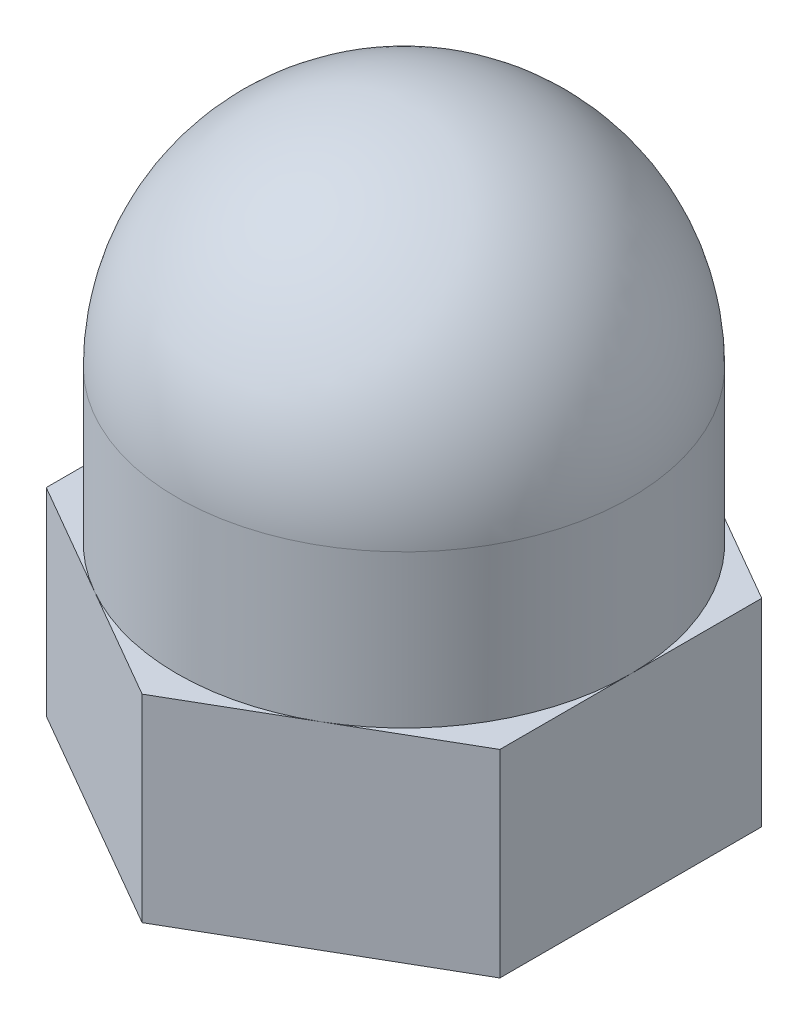
ISO-10303-21;
HEADER;
FILE_DESCRIPTION(('STEP AP214'),'2;1');
FILE_NAME('part.step','',(''),(''),'','','');
FILE_SCHEMA(('AUTOMOTIVE_DESIGN { 1 0 10303 214 1 1 1 1 }'));
ENDSEC;
DATA;
#1=APPLICATION_CONTEXT('core data for automotive mechanical design processes');
#2=APPLICATION_PROTOCOL_DEFINITION('international standard','automotive_design',2000,#1);
#3=PRODUCT_CONTEXT('',#1,'mechanical');
#4=PRODUCT('Part','Part','',(#3));
#5=PRODUCT_RELATED_PRODUCT_CATEGORY('part','',(#4));
#6=PRODUCT_DEFINITION_FORMATION('','',#4);
#7=PRODUCT_DEFINITION_CONTEXT('part definition',#1,'design');
#8=PRODUCT_DEFINITION('design','',#6,#7);
#9=PRODUCT_DEFINITION_SHAPE('','',#8);
#10=(LENGTH_UNIT() NAMED_UNIT(*) SI_UNIT(.MILLI.,.METRE.));
#11=(NAMED_UNIT(*) PLANE_ANGLE_UNIT() SI_UNIT($,.RADIAN.));
#12=(NAMED_UNIT(*) SI_UNIT($,.STERADIAN.) SOLID_ANGLE_UNIT());
#13=UNCERTAINTY_MEASURE_WITH_UNIT(LENGTH_MEASURE(1.E-05),#10,'distance_accuracy_value','');
#14=(GEOMETRIC_REPRESENTATION_CONTEXT(3) GLOBAL_UNCERTAINTY_ASSIGNED_CONTEXT((#13)) GLOBAL_UNIT_ASSIGNED_CONTEXT((#10,
#11,#12)) REPRESENTATION_CONTEXT('',''));
#15=CARTESIAN_POINT('',(0.,0.,0.));
#16=DIRECTION('',(0.,0.,1.));
#17=DIRECTION('',(1.,0.,0.));
#18=AXIS2_PLACEMENT_3D('',#15,#16,#17);
#19=CARTESIAN_POINT('',(0.,2.4,0.));
#20=DIRECTION('',(0.,1.,0.));
#21=DIRECTION('',(0.,0.,1.));
#22=AXIS2_PLACEMENT_3D('',#19,#20,#21);
#23=PLANE('',#22);
#24=CARTESIAN_POINT('',(0.,2.4,0.));
#25=DIRECTION('',(0.,1.,0.));
#26=DIRECTION('',(-1.,0.,0.));
#27=AXIS2_PLACEMENT_3D('',#24,#25,#26);
#28=CIRCLE('',#27,2.75);
#29=CARTESIAN_POINT('',(-2.75,2.4,0.));
#30=VERTEX_POINT('',#29);
#31=CARTESIAN_POINT('',(-1.375,2.4,2.38156986040721));
#32=VERTEX_POINT('',#31);
#33=EDGE_CURVE('E49',#30,#32,#28,.T.);
#34=ORIENTED_EDGE('',*,*,#33,.F.);
#35=DIRECTION('',(0.,0.,1.));
#36=VECTOR('',#35,1.);
#37=CARTESIAN_POINT('',(-2.75,2.4,-1.58771324027147));
#38=LINE('',#37,#36);
#39=CARTESIAN_POINT('',(-2.75,2.4,1.58771324027147));
#40=VERTEX_POINT('',#39);
#41=EDGE_CURVE('E123',#30,#40,#38,.T.);
#42=ORIENTED_EDGE('',*,*,#41,.T.);
#43=DIRECTION('',(0.866025403784439,0.,0.5));
#44=VECTOR('',#43,1.);
#45=CARTESIAN_POINT('',(-2.75,2.4,1.58771324027147));
#46=LINE('',#45,#44);
#47=EDGE_CURVE('E135',#40,#32,#46,.T.);
#48=ORIENTED_EDGE('',*,*,#47,.T.);
#49=EDGE_LOOP('',(#34,#42,#48));
#50=FACE_BOUND('',#49,.T.);
#51=ADVANCED_FACE('F38',(#50),#23,.T.);
#52=CARTESIAN_POINT('',(1.375,2.4,2.38156986040721));
#53=VERTEX_POINT('',#52);
#54=EDGE_CURVE('E11',#32,#53,#28,.T.);
#55=ORIENTED_EDGE('',*,*,#54,.F.);
#56=CARTESIAN_POINT('',(0.,2.4,3.17542648054294));
#57=VERTEX_POINT('',#56);
#58=EDGE_CURVE('E122',#32,#57,#46,.T.);
#59=ORIENTED_EDGE('',*,*,#58,.T.);
#60=DIRECTION('',(0.866025403784439,0.,-0.5));
#61=VECTOR('',#60,1.);
#62=CARTESIAN_POINT('',(0.,2.4,3.17542648054294));
#63=LINE('',#62,#61);
#64=EDGE_CURVE('E159',#57,#53,#63,.T.);
#65=ORIENTED_EDGE('',*,*,#64,.T.);
#66=EDGE_LOOP('',(#55,#59,#65));
#67=FACE_BOUND('',#66,.T.);
#68=ADVANCED_FACE('F204',(#67),#23,.T.);
#69=CARTESIAN_POINT('',(2.75,2.4,0.));
#70=VERTEX_POINT('',#69);
#71=EDGE_CURVE('E47',#53,#70,#28,.T.);
#72=ORIENTED_EDGE('',*,*,#71,.F.);
#73=CARTESIAN_POINT('',(2.75,2.4,1.58771324027147));
#74=VERTEX_POINT('',#73);
#75=EDGE_CURVE('E158',#53,#74,#63,.T.);
#76=ORIENTED_EDGE('',*,*,#75,.T.);
#77=DIRECTION('',(0.,0.,-1.));
#78=VECTOR('',#77,1.);
#79=CARTESIAN_POINT('',(2.75,2.4,1.58771324027147));
#80=LINE('',#79,#78);
#81=EDGE_CURVE('E163',#74,#70,#80,.T.);
#82=ORIENTED_EDGE('',*,*,#81,.T.);
#83=EDGE_LOOP('',(#72,#76,#82));
#84=FACE_BOUND('',#83,.T.);
#85=ADVANCED_FACE('F206',(#84),#23,.T.);
#86=CARTESIAN_POINT('',(1.375,2.4,-2.38156986040721));
#87=VERTEX_POINT('',#86);
#88=EDGE_CURVE('E56',#70,#87,#28,.T.);
#89=ORIENTED_EDGE('',*,*,#88,.F.);
#90=CARTESIAN_POINT('',(2.75,2.4,-1.58771324027147));
#91=VERTEX_POINT('',#90);
#92=EDGE_CURVE('E162',#70,#91,#80,.T.);
#93=ORIENTED_EDGE('',*,*,#92,.T.);
#94=DIRECTION('',(-0.866025403784439,0.,-0.5));
#95=VECTOR('',#94,1.);
#96=CARTESIAN_POINT('',(2.75,2.4,-1.58771324027147));
#97=LINE('',#96,#95);
#98=EDGE_CURVE('E152',#91,#87,#97,.T.);
#99=ORIENTED_EDGE('',*,*,#98,.T.);
#100=EDGE_LOOP('',(#89,#93,#99));
#101=FACE_BOUND('',#100,.T.);
#102=ADVANCED_FACE('F212',(#101),#23,.T.);
#103=CARTESIAN_POINT('',(-1.375,2.4,-2.38156986040721));
#104=VERTEX_POINT('',#103);
#105=EDGE_CURVE('E141',#87,#104,#28,.T.);
#106=ORIENTED_EDGE('',*,*,#105,.F.);
#107=CARTESIAN_POINT('',(0.,2.4,-3.17542648054294));
#108=VERTEX_POINT('',#107);
#109=EDGE_CURVE('E154',#87,#108,#97,.T.);
#110=ORIENTED_EDGE('',*,*,#109,.T.);
#111=DIRECTION('',(-0.866025403784439,0.,0.5));
#112=VECTOR('',#111,1.);
#113=CARTESIAN_POINT('',(0.,2.4,-3.17542648054294));
#114=LINE('',#113,#112);
#115=EDGE_CURVE('E133',#108,#104,#114,.T.);
#116=ORIENTED_EDGE('',*,*,#115,.T.);
#117=EDGE_LOOP('',(#106,#110,#116));
#118=FACE_BOUND('',#117,.T.);
#119=ADVANCED_FACE('F216',(#118),#23,.T.);
#120=EDGE_CURVE('E116',#104,#30,#28,.T.);
#121=ORIENTED_EDGE('',*,*,#120,.F.);
#122=CARTESIAN_POINT('',(-2.75,2.4,-1.58771324027147));
#123=VERTEX_POINT('',#122);
#124=EDGE_CURVE('E118',#104,#123,#114,.T.);
#125=ORIENTED_EDGE('',*,*,#124,.T.);
#126=EDGE_CURVE('E112',#123,#30,#38,.T.);
#127=ORIENTED_EDGE('',*,*,#126,.T.);
#128=EDGE_LOOP('',(#121,#125,#127));
#129=FACE_BOUND('',#128,.T.);
#130=ADVANCED_FACE('F114',(#129),#23,.T.);
#131=CARTESIAN_POINT('',(0.,0.,0.));
#132=DIRECTION('',(0.,1.,0.));
#133=DIRECTION('',(0.,0.,1.));
#134=AXIS2_PLACEMENT_3D('',#131,#132,#133);
#135=PLANE('',#134);
#136=DIRECTION('',(-0.866025403784439,0.,-0.5));
#137=VECTOR('',#136,1.);
#138=CARTESIAN_POINT('',(2.75,0.,-1.58771324027147));
#139=LINE('',#138,#137);
#140=CARTESIAN_POINT('',(2.75,0.,-1.58771324027147));
#141=VERTEX_POINT('',#140);
#142=CARTESIAN_POINT('',(0.,0.,-3.17542648054294));
#143=VERTEX_POINT('',#142);
#144=EDGE_CURVE('E151',#141,#143,#139,.T.);
#145=ORIENTED_EDGE('',*,*,#144,.F.);
#146=DIRECTION('',(0.,0.,-1.));
#147=VECTOR('',#146,1.);
#148=CARTESIAN_POINT('',(2.75,0.,1.58771324027147));
#149=LINE('',#148,#147);
#150=CARTESIAN_POINT('',(2.75,0.,1.58771324027147));
#151=VERTEX_POINT('',#150);
#152=EDGE_CURVE('E176',#151,#141,#149,.T.);
#153=ORIENTED_EDGE('',*,*,#152,.F.);
#154=DIRECTION('',(0.866025403784439,0.,-0.5));
#155=VECTOR('',#154,1.);
#156=CARTESIAN_POINT('',(0.,0.,3.17542648054294));
#157=LINE('',#156,#155);
#158=CARTESIAN_POINT('',(0.,0.,3.17542648054294));
#159=VERTEX_POINT('',#158);
#160=EDGE_CURVE('E174',#159,#151,#157,.T.);
#161=ORIENTED_EDGE('',*,*,#160,.F.);
#162=DIRECTION('',(0.866025403784439,0.,0.5));
#163=VECTOR('',#162,1.);
#164=CARTESIAN_POINT('',(-2.75,0.,1.58771324027147));
#165=LINE('',#164,#163);
#166=CARTESIAN_POINT('',(-2.75,0.,1.58771324027147));
#167=VERTEX_POINT('',#166);
#168=EDGE_CURVE('E172',#167,#159,#165,.T.);
#169=ORIENTED_EDGE('',*,*,#168,.F.);
#170=DIRECTION('',(0.,0.,1.));
#171=VECTOR('',#170,1.);
#172=CARTESIAN_POINT('',(-2.75,0.,-1.58771324027147));
#173=LINE('',#172,#171);
#174=CARTESIAN_POINT('',(-2.75,0.,-1.58771324027147));
#175=VERTEX_POINT('',#174);
#176=EDGE_CURVE('E170',#175,#167,#173,.T.);
#177=ORIENTED_EDGE('',*,*,#176,.F.);
#178=DIRECTION('',(-0.866025403784439,0.,0.5));
#179=VECTOR('',#178,1.);
#180=CARTESIAN_POINT('',(0.,0.,-3.17542648054294));
#181=LINE('',#180,#179);
#182=EDGE_CURVE('E168',#143,#175,#181,.T.);
#183=ORIENTED_EDGE('',*,*,#182,.F.);
#184=EDGE_LOOP('',(#145,#153,#161,#169,#177,#183));
#185=FACE_BOUND('',#184,.T.);
#186=CARTESIAN_POINT('',(0.,0.,0.));
#187=DIRECTION('',(0.,1.,0.));
#188=DIRECTION('',(0.,0.,1.));
#189=AXIS2_PLACEMENT_3D('',#186,#187,#188);
#190=CIRCLE('',#189,1.5);
#191=CARTESIAN_POINT('',(0.,0.,1.5));
#192=VERTEX_POINT('',#191);
#193=EDGE_CURVE('E148',#192,#192,#190,.T.);
#194=ORIENTED_EDGE('',*,*,#193,.T.);
#195=EDGE_LOOP('',(#194));
#196=FACE_BOUND('',#195,.T.);
#197=ADVANCED_FACE('F191',(#185,#196),#135,.F.);
#198=CARTESIAN_POINT('',(2.75,2.4,-1.58771324027147));
#199=DIRECTION('',(-0.5,0.,0.866025403784439));
#200=DIRECTION('',(0.866025403784439,0.,0.5));
#201=AXIS2_PLACEMENT_3D('',#198,#199,#200);
#202=PLANE('',#201);
#203=ORIENTED_EDGE('',*,*,#144,.T.);
#204=DIRECTION('',(0.,-1.,0.));
#205=VECTOR('',#204,1.);
#206=CARTESIAN_POINT('',(0.,2.4,-3.17542648054294));
#207=LINE('',#206,#205);
#208=EDGE_CURVE('E42',#108,#143,#207,.T.);
#209=ORIENTED_EDGE('',*,*,#208,.F.);
#210=ORIENTED_EDGE('',*,*,#109,.F.);
#211=ORIENTED_EDGE('',*,*,#98,.F.);
#212=DIRECTION('',(0.,-1.,0.));
#213=VECTOR('',#212,1.);
#214=CARTESIAN_POINT('',(2.75,2.4,-1.58771324027147));
#215=LINE('',#214,#213);
#216=EDGE_CURVE('E165',#91,#141,#215,.T.);
#217=ORIENTED_EDGE('',*,*,#216,.T.);
#218=EDGE_LOOP('',(#203,#209,#210,#211,#217));
#219=FACE_BOUND('',#218,.T.);
#220=ADVANCED_FACE('F40',(#219),#202,.F.);
#221=CARTESIAN_POINT('',(0.,2.4,-3.17542648054294));
#222=DIRECTION('',(0.5,0.,0.866025403784439));
#223=DIRECTION('',(0.866025403784439,0.,-0.5));
#224=AXIS2_PLACEMENT_3D('',#221,#222,#223);
#225=PLANE('',#224);
#226=ORIENTED_EDGE('',*,*,#182,.T.);
#227=DIRECTION('',(0.,-1.,0.));
#228=VECTOR('',#227,1.);
#229=CARTESIAN_POINT('',(-2.75,2.4,-1.58771324027147));
#230=LINE('',#229,#228);
#231=EDGE_CURVE('E143',#123,#175,#230,.T.);
#232=ORIENTED_EDGE('',*,*,#231,.F.);
#233=ORIENTED_EDGE('',*,*,#124,.F.);
#234=ORIENTED_EDGE('',*,*,#115,.F.);
#235=ORIENTED_EDGE('',*,*,#208,.T.);
#236=EDGE_LOOP('',(#226,#232,#233,#234,#235));
#237=FACE_BOUND('',#236,.T.);
#238=ADVANCED_FACE('F230',(#237),#225,.F.);
#239=CARTESIAN_POINT('',(-2.75,2.4,-1.58771324027147));
#240=DIRECTION('',(1.,0.,0.));
#241=DIRECTION('',(0.,0.,-1.));
#242=AXIS2_PLACEMENT_3D('',#239,#240,#241);
#243=PLANE('',#242);
#244=ORIENTED_EDGE('',*,*,#176,.T.);
#245=DIRECTION('',(0.,-1.,0.));
#246=VECTOR('',#245,1.);
#247=CARTESIAN_POINT('',(-2.75,2.4,1.58771324027147));
#248=LINE('',#247,#246);
#249=EDGE_CURVE('E129',#40,#167,#248,.T.);
#250=ORIENTED_EDGE('',*,*,#249,.F.);
#251=ORIENTED_EDGE('',*,*,#41,.F.);
#252=ORIENTED_EDGE('',*,*,#126,.F.);
#253=ORIENTED_EDGE('',*,*,#231,.T.);
#254=EDGE_LOOP('',(#244,#250,#251,#252,#253));
#255=FACE_BOUND('',#254,.T.);
#256=ADVANCED_FACE('F127',(#255),#243,.F.);
#257=CARTESIAN_POINT('',(-2.75,2.4,1.58771324027147));
#258=DIRECTION('',(0.5,0.,-0.866025403784439));
#259=DIRECTION('',(-0.866025403784439,0.,-0.5));
#260=AXIS2_PLACEMENT_3D('',#257,#258,#259);
#261=PLANE('',#260);
#262=ORIENTED_EDGE('',*,*,#168,.T.);
#263=DIRECTION('',(0.,-1.,0.));
#264=VECTOR('',#263,1.);
#265=CARTESIAN_POINT('',(0.,2.4,3.17542648054294));
#266=LINE('',#265,#264);
#267=EDGE_CURVE('E183',#57,#159,#266,.T.);
#268=ORIENTED_EDGE('',*,*,#267,.F.);
#269=ORIENTED_EDGE('',*,*,#58,.F.);
#270=ORIENTED_EDGE('',*,*,#47,.F.);
#271=ORIENTED_EDGE('',*,*,#249,.T.);
#272=EDGE_LOOP('',(#262,#268,#269,#270,#271));
#273=FACE_BOUND('',#272,.T.);
#274=ADVANCED_FACE('F197',(#273),#261,.F.);
#275=CARTESIAN_POINT('',(0.,2.4,3.17542648054294));
#276=DIRECTION('',(-0.5,0.,-0.866025403784439));
#277=DIRECTION('',(-0.866025403784439,0.,0.5));
#278=AXIS2_PLACEMENT_3D('',#275,#276,#277);
#279=PLANE('',#278);
#280=ORIENTED_EDGE('',*,*,#160,.T.);
#281=DIRECTION('',(0.,-1.,0.));
#282=VECTOR('',#281,1.);
#283=CARTESIAN_POINT('',(2.75,2.4,1.58771324027147));
#284=LINE('',#283,#282);
#285=EDGE_CURVE('E180',#74,#151,#284,.T.);
#286=ORIENTED_EDGE('',*,*,#285,.F.);
#287=ORIENTED_EDGE('',*,*,#75,.F.);
#288=ORIENTED_EDGE('',*,*,#64,.F.);
#289=ORIENTED_EDGE('',*,*,#267,.T.);
#290=EDGE_LOOP('',(#280,#286,#287,#288,#289));
#291=FACE_BOUND('',#290,.T.);
#292=ADVANCED_FACE('F201',(#291),#279,.F.);
#293=CARTESIAN_POINT('',(2.75,2.4,1.58771324027147));
#294=DIRECTION('',(-1.,0.,0.));
#295=DIRECTION('',(0.,0.,1.));
#296=AXIS2_PLACEMENT_3D('',#293,#294,#295);
#297=PLANE('',#296);
#298=ORIENTED_EDGE('',*,*,#152,.T.);
#299=ORIENTED_EDGE('',*,*,#216,.F.);
#300=ORIENTED_EDGE('',*,*,#92,.F.);
#301=ORIENTED_EDGE('',*,*,#81,.F.);
#302=ORIENTED_EDGE('',*,*,#285,.T.);
#303=EDGE_LOOP('',(#298,#299,#300,#301,#302));
#304=FACE_BOUND('',#303,.T.);
#305=ADVANCED_FACE('F221',(#304),#297,.F.);
#306=CARTESIAN_POINT('',(0.,2.4,0.));
#307=DIRECTION('',(0.,-1.,0.));
#308=DIRECTION('',(0.,0.,-1.));
#309=AXIS2_PLACEMENT_3D('',#306,#307,#308);
#310=CYLINDRICAL_SURFACE('',#309,1.5);
#311=CARTESIAN_POINT('',(0.,2.4,0.));
#312=DIRECTION('',(0.,1.,0.));
#313=DIRECTION('',(0.,0.,1.));
#314=AXIS2_PLACEMENT_3D('',#311,#312,#313);
#315=CIRCLE('',#314,1.5);
#316=CARTESIAN_POINT('',(0.,2.4,1.5));
#317=VERTEX_POINT('',#316);
#318=EDGE_CURVE('E137',#317,#317,#315,.T.);
#319=ORIENTED_EDGE('',*,*,#318,.T.);
#320=EDGE_LOOP('',(#319));
#321=FACE_BOUND('',#320,.T.);
#322=ORIENTED_EDGE('',*,*,#193,.F.);
#323=EDGE_LOOP('',(#322));
#324=FACE_BOUND('',#323,.T.);
#325=ADVANCED_FACE('F217',(#321,#324),#310,.F.);
#326=CARTESIAN_POINT('',(0.,7.,0.));
#327=DIRECTION('',(0.,1.,0.));
#328=DIRECTION('',(-1.,0.,0.));
#329=AXIS2_PLACEMENT_3D('',#326,#327,#328);
#330=CYLINDRICAL_SURFACE('',#329,2.75);
#331=CARTESIAN_POINT('',(0.,4.25,0.));
#332=DIRECTION('',(0.,1.,0.));
#333=DIRECTION('',(-1.,0.,0.));
#334=AXIS2_PLACEMENT_3D('',#331,#332,#333);
#335=CIRCLE('',#334,2.75);
#336=CARTESIAN_POINT('',(-2.75,4.25,0.));
#337=VERTEX_POINT('',#336);
#338=EDGE_CURVE('E138',#337,#337,#335,.T.);
#339=ORIENTED_EDGE('',*,*,#338,.F.);
#340=EDGE_LOOP('',(#339));
#341=FACE_BOUND('',#340,.T.);
#342=ORIENTED_EDGE('',*,*,#33,.T.);
#343=ORIENTED_EDGE('',*,*,#54,.T.);
#344=ORIENTED_EDGE('',*,*,#71,.T.);
#345=ORIENTED_EDGE('',*,*,#88,.T.);
#346=ORIENTED_EDGE('',*,*,#105,.T.);
#347=ORIENTED_EDGE('',*,*,#120,.T.);
#348=EDGE_LOOP('',(#342,#343,#344,#345,#346,#347));
#349=FACE_BOUND('',#348,.T.);
#350=ADVANCED_FACE('F140',(#341,#349),#330,.T.);
#351=CARTESIAN_POINT('',(0.,4.25,0.));
#352=DIRECTION('',(0.,1.,0.));
#353=DIRECTION('',(-1.,0.,0.));
#354=AXIS2_PLACEMENT_3D('',#351,#352,#353);
#355=SPHERICAL_SURFACE('',#354,2.75);
#356=ORIENTED_EDGE('',*,*,#338,.T.);
#357=EDGE_LOOP('',(#356));
#358=FACE_BOUND('',#357,.T.);
#359=ADVANCED_FACE('F325',(#358),#355,.T.);
#360=CARTESIAN_POINT('',(0.,2.4,0.));
#361=DIRECTION('',(0.,1.,0.));
#362=DIRECTION('',(-1.,0.,0.));
#363=AXIS2_PLACEMENT_3D('',#360,#361,#362);
#364=PLANE('',#363);
#365=ORIENTED_EDGE('',*,*,#318,.F.);
#366=EDGE_LOOP('',(#365));
#367=FACE_BOUND('',#366,.T.);
#368=ADVANCED_FACE('F335',(#367),#364,.F.);
#369=CLOSED_SHELL('',(#51,#68,#85,#102,#119,#130,#197,#220,#238,#256,#274,#292,#305,#325,#350,
#359,#368));
#370=MANIFOLD_SOLID_BREP('B2',#369);
#371=ADVANCED_BREP_SHAPE_REPRESENTATION('',(#18,#370),#14);
#372=SHAPE_DEFINITION_REPRESENTATION(#9,#371);
ENDSEC;
END-ISO-10303-21;
